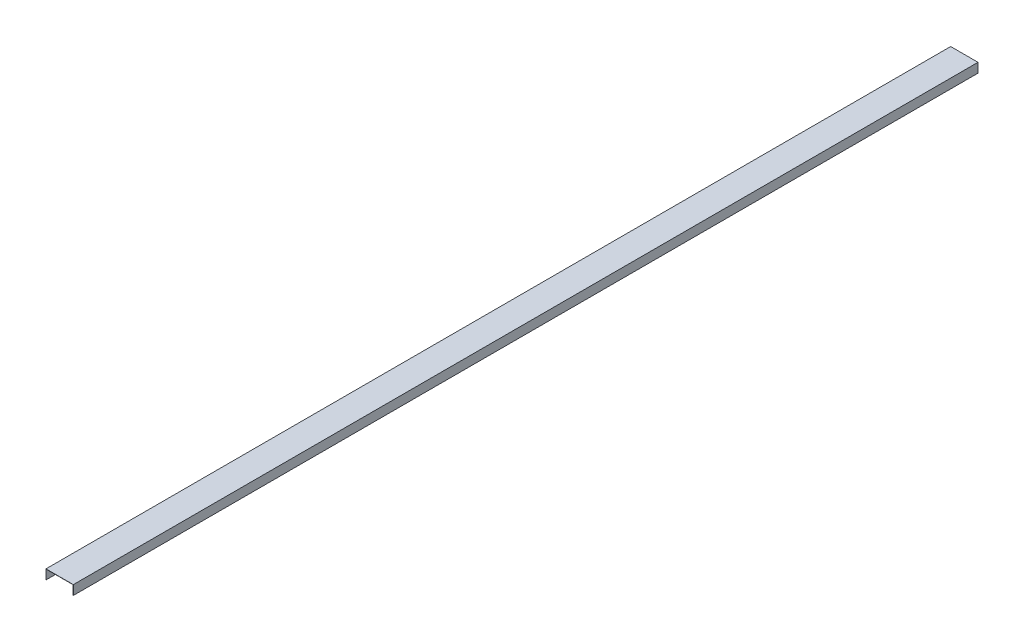
ISO-10303-21;
HEADER;
FILE_DESCRIPTION(('STEP AP214'),'2;1');
FILE_NAME('part.step','',(''),(''),'','','');
FILE_SCHEMA(('AUTOMOTIVE_DESIGN { 1 0 10303 214 1 1 1 1 }'));
ENDSEC;
DATA;
#1=APPLICATION_CONTEXT('core data for automotive mechanical design processes');
#2=APPLICATION_PROTOCOL_DEFINITION('international standard','automotive_design',2000,#1);
#3=PRODUCT_CONTEXT('',#1,'mechanical');
#4=PRODUCT('Part','Part','',(#3));
#5=PRODUCT_RELATED_PRODUCT_CATEGORY('part','',(#4));
#6=PRODUCT_DEFINITION_FORMATION('','',#4);
#7=PRODUCT_DEFINITION_CONTEXT('part definition',#1,'design');
#8=PRODUCT_DEFINITION('design','',#6,#7);
#9=PRODUCT_DEFINITION_SHAPE('','',#8);
#10=(LENGTH_UNIT() NAMED_UNIT(*) SI_UNIT(.MILLI.,.METRE.));
#11=(NAMED_UNIT(*) PLANE_ANGLE_UNIT() SI_UNIT($,.RADIAN.));
#12=(NAMED_UNIT(*) SI_UNIT($,.STERADIAN.) SOLID_ANGLE_UNIT());
#13=UNCERTAINTY_MEASURE_WITH_UNIT(LENGTH_MEASURE(1.E-05),#10,'distance_accuracy_value','');
#14=(GEOMETRIC_REPRESENTATION_CONTEXT(3) GLOBAL_UNCERTAINTY_ASSIGNED_CONTEXT((#13)) GLOBAL_UNIT_ASSIGNED_CONTEXT((#10,
#11,#12)) REPRESENTATION_CONTEXT('',''));
#15=CARTESIAN_POINT('',(0.,0.,0.));
#16=DIRECTION('',(0.,0.,1.));
#17=DIRECTION('',(1.,0.,0.));
#18=AXIS2_PLACEMENT_3D('',#15,#16,#17);
#19=CARTESIAN_POINT('',(-46.0375000000002,31.75,-1524.));
#20=DIRECTION('',(0.,0.,1.));
#21=DIRECTION('',(1.,0.,0.));
#22=AXIS2_PLACEMENT_3D('',#19,#20,#21);
#23=PLANE('',#22);
#24=DIRECTION('',(0.,-1.,0.));
#25=VECTOR('',#24,1.);
#26=CARTESIAN_POINT('',(45.2755000000002,30.988,-1524.));
#27=LINE('',#26,#25);
#28=CARTESIAN_POINT('',(45.2755000000002,30.988,-1524.));
#29=VERTEX_POINT('',#28);
#30=CARTESIAN_POINT('',(45.2755000000002,0.,-1524.));
#31=VERTEX_POINT('',#30);
#32=EDGE_CURVE('E119',#29,#31,#27,.T.);
#33=ORIENTED_EDGE('',*,*,#32,.F.);
#34=DIRECTION('',(-1.,0.,0.));
#35=VECTOR('',#34,1.);
#36=CARTESIAN_POINT('',(-45.2755000000002,30.988,-1524.));
#37=LINE('',#36,#35);
#38=CARTESIAN_POINT('',(-45.2755000000002,30.988,-1524.));
#39=VERTEX_POINT('',#38);
#40=EDGE_CURVE('E107',#29,#39,#37,.T.);
#41=ORIENTED_EDGE('',*,*,#40,.T.);
#42=DIRECTION('',(0.,-1.,0.));
#43=VECTOR('',#42,1.);
#44=CARTESIAN_POINT('',(-45.2755000000002,30.988,-1524.));
#45=LINE('',#44,#43);
#46=CARTESIAN_POINT('',(-45.2755000000002,0.,-1524.));
#47=VERTEX_POINT('',#46);
#48=EDGE_CURVE('E127',#39,#47,#45,.T.);
#49=ORIENTED_EDGE('',*,*,#48,.T.);
#50=DIRECTION('',(-1.,0.,0.));
#51=VECTOR('',#50,1.);
#52=CARTESIAN_POINT('',(-46.0375000000002,0.,-1524.));
#53=LINE('',#52,#51);
#54=CARTESIAN_POINT('',(-46.0375000000002,0.,-1524.));
#55=VERTEX_POINT('',#54);
#56=EDGE_CURVE('E130',#47,#55,#53,.T.);
#57=ORIENTED_EDGE('',*,*,#56,.T.);
#58=DIRECTION('',(0.,-1.,0.));
#59=VECTOR('',#58,1.);
#60=CARTESIAN_POINT('',(-46.0375000000002,31.75,-1524.));
#61=LINE('',#60,#59);
#62=CARTESIAN_POINT('',(-46.0375000000002,31.75,-1524.));
#63=VERTEX_POINT('',#62);
#64=EDGE_CURVE('E40',#63,#55,#61,.T.);
#65=ORIENTED_EDGE('',*,*,#64,.F.);
#66=DIRECTION('',(-1.,0.,0.));
#67=VECTOR('',#66,1.);
#68=CARTESIAN_POINT('',(-46.0375000000002,31.75,-1524.));
#69=LINE('',#68,#67);
#70=CARTESIAN_POINT('',(46.0374999999998,31.75,-1524.));
#71=VERTEX_POINT('',#70);
#72=EDGE_CURVE('E84',#71,#63,#69,.T.);
#73=ORIENTED_EDGE('',*,*,#72,.F.);
#74=DIRECTION('',(0.,-1.,0.));
#75=VECTOR('',#74,1.);
#76=CARTESIAN_POINT('',(46.0374999999998,31.75,-1524.));
#77=LINE('',#76,#75);
#78=CARTESIAN_POINT('',(46.0374999999998,0.,-1524.));
#79=VERTEX_POINT('',#78);
#80=EDGE_CURVE('E11',#71,#79,#77,.T.);
#81=ORIENTED_EDGE('',*,*,#80,.T.);
#82=EDGE_CURVE('E125',#79,#31,#53,.T.);
#83=ORIENTED_EDGE('',*,*,#82,.T.);
#84=EDGE_LOOP('',(#33,#41,#49,#57,#65,#73,#81,#83));
#85=FACE_BOUND('',#84,.T.);
#86=ADVANCED_FACE('F32',(#85),#23,.F.);
#87=CARTESIAN_POINT('',(-46.0374999999998,31.75,1524.));
#88=DIRECTION('',(0.,0.,-1.));
#89=DIRECTION('',(-1.,0.,0.));
#90=AXIS2_PLACEMENT_3D('',#87,#88,#89);
#91=PLANE('',#90);
#92=DIRECTION('',(0.,-1.,0.));
#93=VECTOR('',#92,1.);
#94=CARTESIAN_POINT('',(45.2755000000002,30.988,1524.));
#95=LINE('',#94,#93);
#96=CARTESIAN_POINT('',(45.2755000000002,30.988,1524.));
#97=VERTEX_POINT('',#96);
#98=CARTESIAN_POINT('',(45.2755000000002,0.,1524.));
#99=VERTEX_POINT('',#98);
#100=EDGE_CURVE('E121',#97,#99,#95,.T.);
#101=ORIENTED_EDGE('',*,*,#100,.T.);
#102=DIRECTION('',(1.,0.,0.));
#103=VECTOR('',#102,1.);
#104=CARTESIAN_POINT('',(-46.0374999999998,0.,1524.));
#105=LINE('',#104,#103);
#106=CARTESIAN_POINT('',(46.0375000000002,0.,1524.));
#107=VERTEX_POINT('',#106);
#108=EDGE_CURVE('E77',#99,#107,#105,.T.);
#109=ORIENTED_EDGE('',*,*,#108,.T.);
#110=DIRECTION('',(0.,-1.,0.));
#111=VECTOR('',#110,1.);
#112=CARTESIAN_POINT('',(46.0375000000002,31.75,1524.));
#113=LINE('',#112,#111);
#114=CARTESIAN_POINT('',(46.0375000000002,31.75,1524.));
#115=VERTEX_POINT('',#114);
#116=EDGE_CURVE('E141',#115,#107,#113,.T.);
#117=ORIENTED_EDGE('',*,*,#116,.F.);
#118=DIRECTION('',(1.,0.,0.));
#119=VECTOR('',#118,1.);
#120=CARTESIAN_POINT('',(-46.0374999999998,31.75,1524.));
#121=LINE('',#120,#119);
#122=CARTESIAN_POINT('',(-46.0374999999998,31.75,1524.));
#123=VERTEX_POINT('',#122);
#124=EDGE_CURVE('E56',#123,#115,#121,.T.);
#125=ORIENTED_EDGE('',*,*,#124,.F.);
#126=DIRECTION('',(0.,-1.,0.));
#127=VECTOR('',#126,1.);
#128=CARTESIAN_POINT('',(-46.0374999999998,31.75,1524.));
#129=LINE('',#128,#127);
#130=CARTESIAN_POINT('',(-46.0374999999998,0.,1524.));
#131=VERTEX_POINT('',#130);
#132=EDGE_CURVE('E149',#123,#131,#129,.T.);
#133=ORIENTED_EDGE('',*,*,#132,.T.);
#134=CARTESIAN_POINT('',(-45.2755000000002,0.,1524.));
#135=VERTEX_POINT('',#134);
#136=EDGE_CURVE('E137',#131,#135,#105,.T.);
#137=ORIENTED_EDGE('',*,*,#136,.T.);
#138=DIRECTION('',(0.,-1.,0.));
#139=VECTOR('',#138,1.);
#140=CARTESIAN_POINT('',(-45.2755000000002,30.988,1524.));
#141=LINE('',#140,#139);
#142=CARTESIAN_POINT('',(-45.2755000000002,30.988,1524.));
#143=VERTEX_POINT('',#142);
#144=EDGE_CURVE('E47',#143,#135,#141,.T.);
#145=ORIENTED_EDGE('',*,*,#144,.F.);
#146=DIRECTION('',(1.,0.,0.));
#147=VECTOR('',#146,1.);
#148=CARTESIAN_POINT('',(-45.2755000000002,30.988,1524.));
#149=LINE('',#148,#147);
#150=EDGE_CURVE('E192',#143,#97,#149,.T.);
#151=ORIENTED_EDGE('',*,*,#150,.T.);
#152=EDGE_LOOP('',(#101,#109,#117,#125,#133,#137,#145,#151));
#153=FACE_BOUND('',#152,.T.);
#154=ADVANCED_FACE('F161',(#153),#91,.F.);
#155=CARTESIAN_POINT('',(0.,0.,0.));
#156=DIRECTION('',(0.,1.,0.));
#157=DIRECTION('',(0.,0.,1.));
#158=AXIS2_PLACEMENT_3D('',#155,#156,#157);
#159=PLANE('',#158);
#160=DIRECTION('',(0.,0.,-1.));
#161=VECTOR('',#160,1.);
#162=CARTESIAN_POINT('',(45.2755000000002,0.,-1524.));
#163=LINE('',#162,#161);
#164=EDGE_CURVE('E188',#99,#31,#163,.T.);
#165=ORIENTED_EDGE('',*,*,#164,.T.);
#166=ORIENTED_EDGE('',*,*,#82,.F.);
#167=DIRECTION('',(0.,0.,-1.));
#168=VECTOR('',#167,1.);
#169=CARTESIAN_POINT('',(46.0374999999998,0.,-1524.));
#170=LINE('',#169,#168);
#171=EDGE_CURVE('E126',#107,#79,#170,.T.);
#172=ORIENTED_EDGE('',*,*,#171,.F.);
#173=ORIENTED_EDGE('',*,*,#108,.F.);
#174=EDGE_LOOP('',(#165,#166,#172,#173));
#175=FACE_BOUND('',#174,.T.);
#176=ADVANCED_FACE('F181',(#175),#159,.F.);
#177=DIRECTION('',(0.,0.,1.));
#178=VECTOR('',#177,1.);
#179=CARTESIAN_POINT('',(-45.2755000000002,0.,-1524.));
#180=LINE('',#179,#178);
#181=EDGE_CURVE('E122',#47,#135,#180,.T.);
#182=ORIENTED_EDGE('',*,*,#181,.T.);
#183=ORIENTED_EDGE('',*,*,#136,.F.);
#184=DIRECTION('',(0.,0.,1.));
#185=VECTOR('',#184,1.);
#186=CARTESIAN_POINT('',(-46.0375000000002,0.,-1524.));
#187=LINE('',#186,#185);
#188=EDGE_CURVE('E144',#55,#131,#187,.T.);
#189=ORIENTED_EDGE('',*,*,#188,.F.);
#190=ORIENTED_EDGE('',*,*,#56,.F.);
#191=EDGE_LOOP('',(#182,#183,#189,#190));
#192=FACE_BOUND('',#191,.T.);
#193=ADVANCED_FACE('F160',(#192),#159,.F.);
#194=CARTESIAN_POINT('',(46.0374999999998,31.75,-1524.));
#195=DIRECTION('',(-1.,0.,0.));
#196=DIRECTION('',(0.,0.,1.));
#197=AXIS2_PLACEMENT_3D('',#194,#195,#196);
#198=PLANE('',#197);
#199=ORIENTED_EDGE('',*,*,#171,.T.);
#200=ORIENTED_EDGE('',*,*,#80,.F.);
#201=DIRECTION('',(0.,0.,-1.));
#202=VECTOR('',#201,1.);
#203=CARTESIAN_POINT('',(46.0374999999998,31.75,-1524.));
#204=LINE('',#203,#202);
#205=EDGE_CURVE('E135',#115,#71,#204,.T.);
#206=ORIENTED_EDGE('',*,*,#205,.F.);
#207=ORIENTED_EDGE('',*,*,#116,.T.);
#208=EDGE_LOOP('',(#199,#200,#206,#207));
#209=FACE_BOUND('',#208,.T.);
#210=ADVANCED_FACE('F34',(#209),#198,.F.);
#211=CARTESIAN_POINT('',(-46.0375000000002,31.75,-1524.));
#212=DIRECTION('',(1.,0.,0.));
#213=DIRECTION('',(0.,0.,-1.));
#214=AXIS2_PLACEMENT_3D('',#211,#212,#213);
#215=PLANE('',#214);
#216=ORIENTED_EDGE('',*,*,#188,.T.);
#217=ORIENTED_EDGE('',*,*,#132,.F.);
#218=DIRECTION('',(0.,0.,1.));
#219=VECTOR('',#218,1.);
#220=CARTESIAN_POINT('',(-46.0375000000002,31.75,-1524.));
#221=LINE('',#220,#219);
#222=EDGE_CURVE('E139',#63,#123,#221,.T.);
#223=ORIENTED_EDGE('',*,*,#222,.F.);
#224=ORIENTED_EDGE('',*,*,#64,.T.);
#225=EDGE_LOOP('',(#216,#217,#223,#224));
#226=FACE_BOUND('',#225,.T.);
#227=ADVANCED_FACE('F155',(#226),#215,.F.);
#228=CARTESIAN_POINT('',(0.,31.75,0.));
#229=DIRECTION('',(0.,1.,0.));
#230=DIRECTION('',(0.,0.,1.));
#231=AXIS2_PLACEMENT_3D('',#228,#229,#230);
#232=PLANE('',#231);
#233=ORIENTED_EDGE('',*,*,#205,.T.);
#234=ORIENTED_EDGE('',*,*,#72,.T.);
#235=ORIENTED_EDGE('',*,*,#222,.T.);
#236=ORIENTED_EDGE('',*,*,#124,.T.);
#237=EDGE_LOOP('',(#233,#234,#235,#236));
#238=FACE_BOUND('',#237,.T.);
#239=ADVANCED_FACE('F166',(#238),#232,.T.);
#240=CARTESIAN_POINT('',(45.2755000000002,30.988,-1524.));
#241=DIRECTION('',(-1.,0.,0.));
#242=DIRECTION('',(0.,0.,1.));
#243=AXIS2_PLACEMENT_3D('',#240,#241,#242);
#244=PLANE('',#243);
#245=ORIENTED_EDGE('',*,*,#164,.F.);
#246=ORIENTED_EDGE('',*,*,#100,.F.);
#247=DIRECTION('',(0.,0.,-1.));
#248=VECTOR('',#247,1.);
#249=CARTESIAN_POINT('',(45.2755000000002,30.988,-1524.));
#250=LINE('',#249,#248);
#251=EDGE_CURVE('E111',#97,#29,#250,.T.);
#252=ORIENTED_EDGE('',*,*,#251,.T.);
#253=ORIENTED_EDGE('',*,*,#32,.T.);
#254=EDGE_LOOP('',(#245,#246,#252,#253));
#255=FACE_BOUND('',#254,.T.);
#256=ADVANCED_FACE('F118',(#255),#244,.T.);
#257=CARTESIAN_POINT('',(-45.2755000000002,30.988,-1524.));
#258=DIRECTION('',(1.,0.,0.));
#259=DIRECTION('',(0.,0.,-1.));
#260=AXIS2_PLACEMENT_3D('',#257,#258,#259);
#261=PLANE('',#260);
#262=ORIENTED_EDGE('',*,*,#181,.F.);
#263=ORIENTED_EDGE('',*,*,#48,.F.);
#264=DIRECTION('',(0.,0.,1.));
#265=VECTOR('',#264,1.);
#266=CARTESIAN_POINT('',(-45.2755000000002,30.988,-1524.));
#267=LINE('',#266,#265);
#268=EDGE_CURVE('E113',#39,#143,#267,.T.);
#269=ORIENTED_EDGE('',*,*,#268,.T.);
#270=ORIENTED_EDGE('',*,*,#144,.T.);
#271=EDGE_LOOP('',(#262,#263,#269,#270));
#272=FACE_BOUND('',#271,.T.);
#273=ADVANCED_FACE('F173',(#272),#261,.T.);
#274=CARTESIAN_POINT('',(0.,30.988,0.));
#275=DIRECTION('',(0.,1.,0.));
#276=DIRECTION('',(0.,0.,1.));
#277=AXIS2_PLACEMENT_3D('',#274,#275,#276);
#278=PLANE('',#277);
#279=ORIENTED_EDGE('',*,*,#251,.F.);
#280=ORIENTED_EDGE('',*,*,#150,.F.);
#281=ORIENTED_EDGE('',*,*,#268,.F.);
#282=ORIENTED_EDGE('',*,*,#40,.F.);
#283=EDGE_LOOP('',(#279,#280,#281,#282));
#284=FACE_BOUND('',#283,.T.);
#285=ADVANCED_FACE('F109',(#284),#278,.F.);
#286=CLOSED_SHELL('',(#86,#154,#176,#193,#210,#227,#239,#256,#273,#285));
#287=MANIFOLD_SOLID_BREP('B2',#286);
#288=ADVANCED_BREP_SHAPE_REPRESENTATION('',(#18,#287),#14);
#289=SHAPE_DEFINITION_REPRESENTATION(#9,#288);
ENDSEC;
END-ISO-10303-21;
